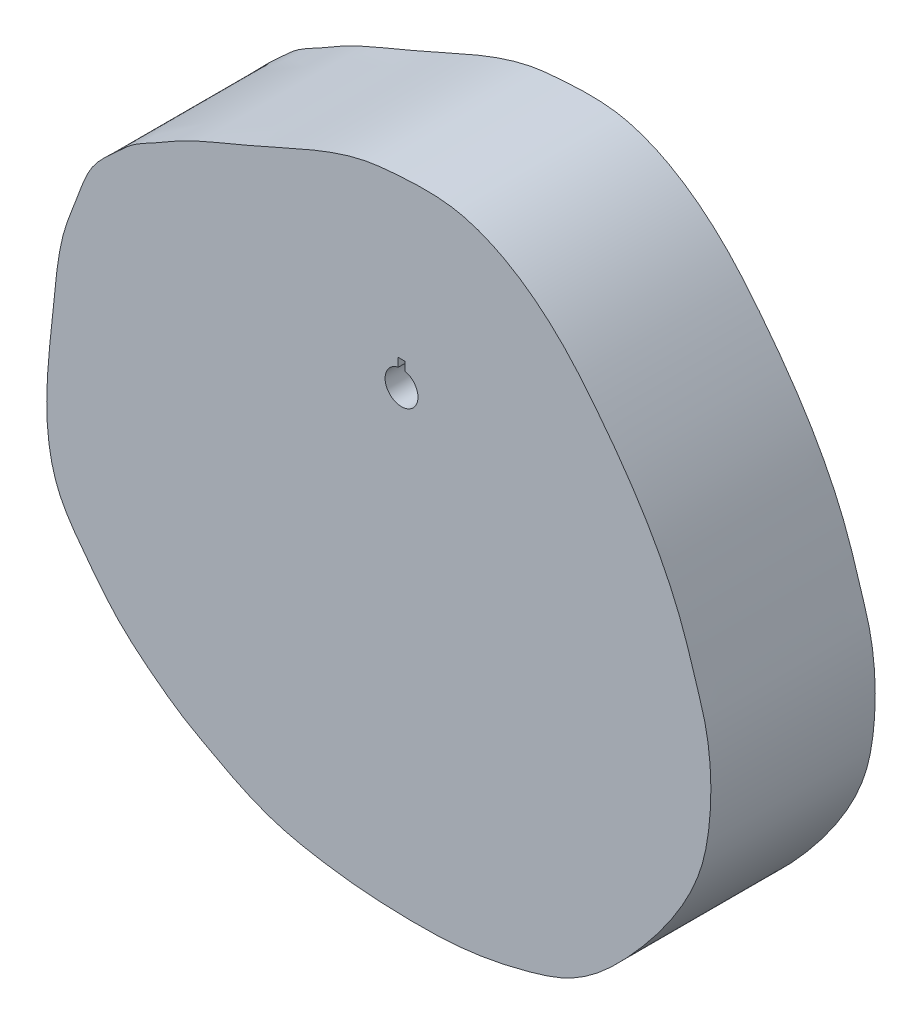
ISO-10303-21;
HEADER;
FILE_DESCRIPTION(('STEP AP214'),'2;1');
FILE_NAME('part.step','',(''),(''),'','','');
FILE_SCHEMA(('AUTOMOTIVE_DESIGN { 1 0 10303 214 1 1 1 1 }'));
ENDSEC;
DATA;
#1=APPLICATION_CONTEXT('core data for automotive mechanical design processes');
#2=APPLICATION_PROTOCOL_DEFINITION('international standard','automotive_design',2000,#1);
#3=PRODUCT_CONTEXT('',#1,'mechanical');
#4=PRODUCT('Part','Part','',(#3));
#5=PRODUCT_RELATED_PRODUCT_CATEGORY('part','',(#4));
#6=PRODUCT_DEFINITION_FORMATION('','',#4);
#7=PRODUCT_DEFINITION_CONTEXT('part definition',#1,'design');
#8=PRODUCT_DEFINITION('design','',#6,#7);
#9=PRODUCT_DEFINITION_SHAPE('','',#8);
#10=(LENGTH_UNIT() NAMED_UNIT(*) SI_UNIT(.MILLI.,.METRE.));
#11=(NAMED_UNIT(*) PLANE_ANGLE_UNIT() SI_UNIT($,.RADIAN.));
#12=(NAMED_UNIT(*) SI_UNIT($,.STERADIAN.) SOLID_ANGLE_UNIT());
#13=UNCERTAINTY_MEASURE_WITH_UNIT(LENGTH_MEASURE(1.E-05),#10,'distance_accuracy_value','');
#14=(GEOMETRIC_REPRESENTATION_CONTEXT(3) GLOBAL_UNCERTAINTY_ASSIGNED_CONTEXT((#13)) GLOBAL_UNIT_ASSIGNED_CONTEXT((#10,
#11,#12)) REPRESENTATION_CONTEXT('',''));
#15=CARTESIAN_POINT('',(0.,0.,0.));
#16=DIRECTION('',(0.,0.,1.));
#17=DIRECTION('',(1.,0.,0.));
#18=AXIS2_PLACEMENT_3D('',#15,#16,#17);
#19=CARTESIAN_POINT('',(60.2647803164845,1.48469961481105,10.));
#20=DIRECTION('',(0.999696665086117,0.0246288005330246,0.));
#21=DIRECTION('',(-0.0246288005330246,0.999696665086117,0.));
#22=AXIS2_PLACEMENT_3D('',#19,#20,#21);
#23=PLANE('',#22);
#24=DIRECTION('',(0.0246288005330246,-0.999696665086117,0.));
#25=VECTOR('',#24,1.);
#26=CARTESIAN_POINT('',(60.2647803164845,1.48469961481105,0.));
#27=LINE('',#26,#25);
#28=CARTESIAN_POINT('',(58.7,65.,0.));
#29=VERTEX_POINT('',#28);
#30=CARTESIAN_POINT('',(58.7128828561134,64.4770777295451,0.));
#31=VERTEX_POINT('',#30);
#32=EDGE_CURVE('E117',#29,#31,#27,.T.);
#33=ORIENTED_EDGE('',*,*,#32,.T.);
#34=DIRECTION('',(0.,0.,-1.));
#35=VECTOR('',#34,1.);
#36=CARTESIAN_POINT('',(58.7128828561134,64.4770777295451,10.));
#37=LINE('',#36,#35);
#38=CARTESIAN_POINT('',(58.7128828561134,64.4770777295451,10.));
#39=VERTEX_POINT('',#38);
#40=EDGE_CURVE('E11',#39,#31,#37,.T.);
#41=ORIENTED_EDGE('',*,*,#40,.F.);
#42=DIRECTION('',(0.0246288005330246,-0.999696665086117,0.));
#43=VECTOR('',#42,1.);
#44=CARTESIAN_POINT('',(60.2647803164845,1.48469961481105,10.));
#45=LINE('',#44,#43);
#46=CARTESIAN_POINT('',(58.7,65.,10.));
#47=VERTEX_POINT('',#46);
#48=EDGE_CURVE('E82',#47,#39,#45,.T.);
#49=ORIENTED_EDGE('',*,*,#48,.F.);
#50=DIRECTION('',(0.,0.,-1.));
#51=VECTOR('',#50,1.);
#52=CARTESIAN_POINT('',(58.7,65.,10.));
#53=LINE('',#52,#51);
#54=EDGE_CURVE('E58',#47,#29,#53,.T.);
#55=ORIENTED_EDGE('',*,*,#54,.T.);
#56=EDGE_LOOP('',(#33,#41,#49,#55));
#57=FACE_BOUND('',#56,.T.);
#58=ADVANCED_FACE('F41',(#57),#23,.F.);
#59=CARTESIAN_POINT('',(58.5,63.5,10.));
#60=DIRECTION('',(0.,0.,-1.));
#61=DIRECTION('',(-1.,0.,0.));
#62=AXIS2_PLACEMENT_3D('',#59,#60,#61);
#63=CYLINDRICAL_SURFACE('',#62,1.);
#64=CARTESIAN_POINT('',(58.5,63.5,0.));
#65=DIRECTION('',(0.,0.,1.));
#66=DIRECTION('',(1.,0.,0.));
#67=AXIS2_PLACEMENT_3D('',#64,#65,#66);
#68=CIRCLE('',#67,1.);
#69=CARTESIAN_POINT('',(58.3,64.4797958971133,0.));
#70=VERTEX_POINT('',#69);
#71=EDGE_CURVE('E91',#70,#31,#68,.T.);
#72=ORIENTED_EDGE('',*,*,#71,.F.);
#73=DIRECTION('',(0.,0.,-1.));
#74=VECTOR('',#73,1.);
#75=CARTESIAN_POINT('',(58.3,64.4797958971133,10.));
#76=LINE('',#75,#74);
#77=CARTESIAN_POINT('',(58.3,64.4797958971133,10.));
#78=VERTEX_POINT('',#77);
#79=EDGE_CURVE('E50',#78,#70,#76,.T.);
#80=ORIENTED_EDGE('',*,*,#79,.F.);
#81=CARTESIAN_POINT('',(58.5,63.5,10.));
#82=DIRECTION('',(0.,0.,1.));
#83=DIRECTION('',(1.,0.,0.));
#84=AXIS2_PLACEMENT_3D('',#81,#82,#83);
#85=CIRCLE('',#84,1.);
#86=EDGE_CURVE('E89',#78,#39,#85,.T.);
#87=ORIENTED_EDGE('',*,*,#86,.T.);
#88=ORIENTED_EDGE('',*,*,#40,.T.);
#89=EDGE_LOOP('',(#72,#80,#87,#88));
#90=FACE_BOUND('',#89,.T.);
#91=ADVANCED_FACE('F88',(#90),#63,.F.);
#92=CARTESIAN_POINT('',(58.3,0.,10.));
#93=DIRECTION('',(1.,0.,0.));
#94=DIRECTION('',(0.,0.,-1.));
#95=AXIS2_PLACEMENT_3D('',#92,#93,#94);
#96=PLANE('',#95);
#97=DIRECTION('',(0.,-1.,0.));
#98=VECTOR('',#97,1.);
#99=CARTESIAN_POINT('',(58.3,0.,0.));
#100=LINE('',#99,#98);
#101=CARTESIAN_POINT('',(58.3,65.,0.));
#102=VERTEX_POINT('',#101);
#103=EDGE_CURVE('E144',#102,#70,#100,.T.);
#104=ORIENTED_EDGE('',*,*,#103,.F.);
#105=DIRECTION('',(0.,0.,-1.));
#106=VECTOR('',#105,1.);
#107=CARTESIAN_POINT('',(58.3,65.,10.));
#108=LINE('',#107,#106);
#109=CARTESIAN_POINT('',(58.3,65.,10.));
#110=VERTEX_POINT('',#109);
#111=EDGE_CURVE('E71',#110,#102,#108,.T.);
#112=ORIENTED_EDGE('',*,*,#111,.F.);
#113=DIRECTION('',(0.,-1.,0.));
#114=VECTOR('',#113,1.);
#115=CARTESIAN_POINT('',(58.3,0.,10.));
#116=LINE('',#115,#114);
#117=EDGE_CURVE('E99',#110,#78,#116,.T.);
#118=ORIENTED_EDGE('',*,*,#117,.T.);
#119=ORIENTED_EDGE('',*,*,#79,.T.);
#120=EDGE_LOOP('',(#104,#112,#118,#119));
#121=FACE_BOUND('',#120,.T.);
#122=ADVANCED_FACE('F102',(#121),#96,.T.);
#123=CARTESIAN_POINT('',(0.,65.,10.));
#124=DIRECTION('',(0.,-1.,0.));
#125=DIRECTION('',(0.,0.,-1.));
#126=AXIS2_PLACEMENT_3D('',#123,#124,#125);
#127=PLANE('',#126);
#128=DIRECTION('',(-1.,0.,0.));
#129=VECTOR('',#128,1.);
#130=CARTESIAN_POINT('',(0.,65.,0.));
#131=LINE('',#130,#129);
#132=EDGE_CURVE('E147',#29,#102,#131,.T.);
#133=ORIENTED_EDGE('',*,*,#132,.F.);
#134=ORIENTED_EDGE('',*,*,#54,.F.);
#135=DIRECTION('',(-1.,0.,0.));
#136=VECTOR('',#135,1.);
#137=CARTESIAN_POINT('',(0.,65.,10.));
#138=LINE('',#137,#136);
#139=EDGE_CURVE('E104',#47,#110,#138,.T.);
#140=ORIENTED_EDGE('',*,*,#139,.T.);
#141=ORIENTED_EDGE('',*,*,#111,.T.);
#142=EDGE_LOOP('',(#133,#134,#140,#141));
#143=FACE_BOUND('',#142,.T.);
#144=ADVANCED_FACE('F127',(#143),#127,.T.);
#145=CARTESIAN_POINT('',(50.9982859504944,72.410227179123,10.));
#146=CARTESIAN_POINT('',(52.0085520398406,72.8632350951781,10.));
#147=CARTESIAN_POINT('',(53.7695737711782,73.6565490633208,10.));
#148=CARTESIAN_POINT('',(56.1979492523966,74.4105602004165,10.));
#149=CARTESIAN_POINT('',(58.2935294382534,74.6044237773413,10.));
#150=CARTESIAN_POINT('',(60.0662069810574,74.6930824065783,10.));
#151=CARTESIAN_POINT('',(62.0608422149145,74.5413517076234,10.));
#152=CARTESIAN_POINT('',(64.1262698282226,73.834318473206,10.));
#153=CARTESIAN_POINT('',(66.3492086646689,72.4904360348317,10.));
#154=CARTESIAN_POINT('',(68.4759576068629,70.6160902387612,10.));
#155=CARTESIAN_POINT('',(70.7592138576603,67.8436403335527,10.));
#156=CARTESIAN_POINT('',(73.3602957316741,64.2575230247137,10.));
#157=CARTESIAN_POINT('',(75.4594837974279,60.1789548076152,10.));
#158=CARTESIAN_POINT('',(76.357096747083,57.1264026160967,10.));
#159=CARTESIAN_POINT('',(77.0029252758511,55.061063066837,10.));
#160=CARTESIAN_POINT('',(77.35695055899,53.0176526349087,10.));
#161=CARTESIAN_POINT('',(77.3349396474433,50.2853513577748,10.));
#162=CARTESIAN_POINT('',(76.8222278468291,47.0301572790668,10.));
#163=CARTESIAN_POINT('',(75.0919714550439,43.7173208896473,10.));
#164=CARTESIAN_POINT('',(72.6547283416254,40.6943020931718,10.));
#165=CARTESIAN_POINT('',(70.4240801769504,38.5028066046952,10.));
#166=CARTESIAN_POINT('',(68.3164615286703,37.217387765986,10.));
#167=CARTESIAN_POINT('',(66.2388614862156,36.5726858861365,10.));
#168=CARTESIAN_POINT('',(63.9625768579655,36.0367681799563,10.));
#169=CARTESIAN_POINT('',(61.3674768862498,35.7018776215787,10.));
#170=CARTESIAN_POINT('',(58.7261807610321,35.6854273448347,10.));
#171=CARTESIAN_POINT('',(56.0679191285743,35.8111231598624,10.));
#172=CARTESIAN_POINT('',(53.5441679746272,36.1374827182844,10.));
#173=CARTESIAN_POINT('',(51.1189415504198,36.5945545087518,10.));
#174=CARTESIAN_POINT('',(48.8133491793314,37.5050450856228,10.));
#175=CARTESIAN_POINT('',(46.9758695760217,38.5050757308152,10.));
#176=CARTESIAN_POINT('',(45.2338461450234,39.4393400996282,10.));
#177=CARTESIAN_POINT('',(43.2773998519364,40.8418369911912,10.));
#178=CARTESIAN_POINT('',(41.1399008253625,42.5960614248552,10.));
#179=CARTESIAN_POINT('',(39.2990342505694,45.0337911249107,10.));
#180=CARTESIAN_POINT('',(37.2994587701624,47.6515807184861,10.));
#181=CARTESIAN_POINT('',(36.7666064982236,51.3900988401894,10.));
#182=CARTESIAN_POINT('',(37.0752886464358,54.9299469177596,10.));
#183=CARTESIAN_POINT('',(37.4291335747734,58.3266329294863,10.));
#184=CARTESIAN_POINT('',(37.7408596869819,61.1760889203692,10.));
#185=CARTESIAN_POINT('',(38.8007323413257,63.6679051644433,10.));
#186=CARTESIAN_POINT('',(39.4993867865125,65.7961173385119,10.));
#187=CARTESIAN_POINT('',(40.9753109636551,67.0731494206314,10.));
#188=CARTESIAN_POINT('',(42.1517449331422,68.2176150286246,10.));
#189=CARTESIAN_POINT('',(43.5098127941302,68.87913164853,10.));
#190=CARTESIAN_POINT('',(45.2241727637935,69.9431414057939,10.));
#191=CARTESIAN_POINT('',(47.3823699707558,70.8561850438718,10.));
#192=CARTESIAN_POINT('',(49.4415360563234,71.7131360685174,10.));
#193=CARTESIAN_POINT('',(50.5908921309927,72.2275499348481,10.));
#194=CARTESIAN_POINT('',(50.9982859504944,72.410227179123,10.));
#195=B_SPLINE_CURVE_WITH_KNOTS('',3,(#145,#146,#147,#148,#149,#150,#151,#152,#153,#154,#155,
#156,#157,#158,#159,#160,#161,#162,#163,#164,#165,#166,#167,#168,#169,#170,#171,#172,#173,#174,
#175,#176,#177,#178,#179,#180,#181,#182,#183,#184,#185,#186,#187,#188,#189,#190,#191,#192,#193,
#194),.UNSPECIFIED.,.T.,.F.,(4,1,1,1,1,1,1,1,1,1,1,1,1,1,1,1,1,1,1,1,1,1,1,1,1,1,1,1,1,1,1,1,1,
1,1,1,1,1,1,1,1,1,1,1,1,1,1,4),(0.,0.0265455863478481,0.0463285542264314,0.0605534748970801,
0.0768678540199245,0.0888743672957881,0.108295375419415,0.12851837030091,0.150854463167809,
0.175897919998208,0.214482615111775,0.256992751277105,0.284989029860573,0.290659406141175,
0.30887567157107,0.334400909758371,0.355920427862491,0.387259923066585,0.42247078319507,
0.449004594851348,0.461678733757254,0.481273674500077,0.500786422936165,0.517774705361233,
0.543868945946732,0.564008174833697,0.581535670918029,0.604880577497864,0.622945932639291,
0.64068846083281,0.655045157728196,0.670269378777531,0.698381103850005,0.720780203522763,
0.743530579865316,0.776229956108014,0.807771363469711,0.829063147911241,0.858259644737761,
0.875614659256024,0.894090137221274,0.910613695039342,0.921398485959152,0.933328696474983,
0.946471969326609,0.96981448338057,0.989295386703357,1.),.UNSPECIFIED.);
#196=DIRECTION('',(0.,0.,-1.));
#197=VECTOR('',#196,1.);
#198=SURFACE_OF_LINEAR_EXTRUSION('',#195,#197);
#199=CARTESIAN_POINT('',(50.9982859504944,72.410227179123,10.));
#200=VERTEX_POINT('',#199);
#201=EDGE_CURVE('E107',#200,#200,#195,.T.);
#202=ORIENTED_EDGE('',*,*,#201,.T.);
#203=EDGE_LOOP('',(#202));
#204=FACE_BOUND('',#203,.T.);
#205=CARTESIAN_POINT('',(50.9982859504944,72.410227179123,0.));
#206=CARTESIAN_POINT('',(52.0085520398406,72.8632350951781,0.));
#207=CARTESIAN_POINT('',(53.7695737711782,73.6565490633208,0.));
#208=CARTESIAN_POINT('',(56.1979492523966,74.4105602004165,0.));
#209=CARTESIAN_POINT('',(58.2935294382534,74.6044237773413,0.));
#210=CARTESIAN_POINT('',(60.0662069810574,74.6930824065783,0.));
#211=CARTESIAN_POINT('',(62.0608422149145,74.5413517076234,0.));
#212=CARTESIAN_POINT('',(64.1262698282226,73.834318473206,0.));
#213=CARTESIAN_POINT('',(66.3492086646689,72.4904360348317,0.));
#214=CARTESIAN_POINT('',(68.4759576068629,70.6160902387612,0.));
#215=CARTESIAN_POINT('',(70.7592138576603,67.8436403335527,0.));
#216=CARTESIAN_POINT('',(73.3602957316741,64.2575230247137,0.));
#217=CARTESIAN_POINT('',(75.4594837974279,60.1789548076152,0.));
#218=CARTESIAN_POINT('',(76.357096747083,57.1264026160967,0.));
#219=CARTESIAN_POINT('',(77.0029252758511,55.061063066837,0.));
#220=CARTESIAN_POINT('',(77.35695055899,53.0176526349087,0.));
#221=CARTESIAN_POINT('',(77.3349396474433,50.2853513577748,0.));
#222=CARTESIAN_POINT('',(76.8222278468291,47.0301572790668,0.));
#223=CARTESIAN_POINT('',(75.0919714550439,43.7173208896473,0.));
#224=CARTESIAN_POINT('',(72.6547283416254,40.6943020931718,0.));
#225=CARTESIAN_POINT('',(70.4240801769504,38.5028066046952,0.));
#226=CARTESIAN_POINT('',(68.3164615286703,37.217387765986,0.));
#227=CARTESIAN_POINT('',(66.2388614862156,36.5726858861365,0.));
#228=CARTESIAN_POINT('',(63.9625768579655,36.0367681799563,0.));
#229=CARTESIAN_POINT('',(61.3674768862498,35.7018776215787,0.));
#230=CARTESIAN_POINT('',(58.7261807610321,35.6854273448347,0.));
#231=CARTESIAN_POINT('',(56.0679191285743,35.8111231598624,0.));
#232=CARTESIAN_POINT('',(53.5441679746272,36.1374827182844,0.));
#233=CARTESIAN_POINT('',(51.1189415504198,36.5945545087518,0.));
#234=CARTESIAN_POINT('',(48.8133491793314,37.5050450856228,0.));
#235=CARTESIAN_POINT('',(46.9758695760217,38.5050757308152,0.));
#236=CARTESIAN_POINT('',(45.2338461450234,39.4393400996282,0.));
#237=CARTESIAN_POINT('',(43.2773998519364,40.8418369911912,0.));
#238=CARTESIAN_POINT('',(41.1399008253625,42.5960614248552,0.));
#239=CARTESIAN_POINT('',(39.2990342505694,45.0337911249107,0.));
#240=CARTESIAN_POINT('',(37.2994587701624,47.6515807184861,0.));
#241=CARTESIAN_POINT('',(36.7666064982236,51.3900988401894,0.));
#242=CARTESIAN_POINT('',(37.0752886464358,54.9299469177596,0.));
#243=CARTESIAN_POINT('',(37.4291335747734,58.3266329294863,0.));
#244=CARTESIAN_POINT('',(37.7408596869819,61.1760889203692,0.));
#245=CARTESIAN_POINT('',(38.8007323413257,63.6679051644433,0.));
#246=CARTESIAN_POINT('',(39.4993867865125,65.7961173385119,0.));
#247=CARTESIAN_POINT('',(40.9753109636551,67.0731494206314,0.));
#248=CARTESIAN_POINT('',(42.1517449331422,68.2176150286246,0.));
#249=CARTESIAN_POINT('',(43.5098127941302,68.87913164853,0.));
#250=CARTESIAN_POINT('',(45.2241727637935,69.9431414057939,0.));
#251=CARTESIAN_POINT('',(47.3823699707558,70.8561850438718,0.));
#252=CARTESIAN_POINT('',(49.4415360563234,71.7131360685174,0.));
#253=CARTESIAN_POINT('',(50.5908921309927,72.2275499348481,0.));
#254=CARTESIAN_POINT('',(50.9982859504944,72.410227179123,0.));
#255=B_SPLINE_CURVE_WITH_KNOTS('',3,(#205,#206,#207,#208,#209,#210,#211,#212,#213,#214,#215,
#216,#217,#218,#219,#220,#221,#222,#223,#224,#225,#226,#227,#228,#229,#230,#231,#232,#233,#234,
#235,#236,#237,#238,#239,#240,#241,#242,#243,#244,#245,#246,#247,#248,#249,#250,#251,#252,#253,
#254),.UNSPECIFIED.,.T.,.F.,(4,1,1,1,1,1,1,1,1,1,1,1,1,1,1,1,1,1,1,1,1,1,1,1,1,1,1,1,1,1,1,1,1,
1,1,1,1,1,1,1,1,1,1,1,1,1,1,4),(0.,0.0265455863478481,0.0463285542264314,0.0605534748970801,
0.0768678540199245,0.0888743672957881,0.108295375419415,0.12851837030091,0.150854463167809,
0.175897919998208,0.214482615111775,0.256992751277105,0.284989029860573,0.290659406141175,
0.30887567157107,0.334400909758371,0.355920427862491,0.387259923066585,0.42247078319507,
0.449004594851348,0.461678733757254,0.481273674500077,0.500786422936165,0.517774705361233,
0.543868945946732,0.564008174833697,0.581535670918029,0.604880577497864,0.622945932639291,
0.64068846083281,0.655045157728196,0.670269378777531,0.698381103850005,0.720780203522763,
0.743530579865316,0.776229956108014,0.807771363469711,0.829063147911241,0.858259644737761,
0.875614659256024,0.894090137221274,0.910613695039342,0.921398485959152,0.933328696474983,
0.946471969326609,0.96981448338057,0.989295386703357,1.),.UNSPECIFIED.);
#256=CARTESIAN_POINT('',(50.9982859504944,72.410227179123,0.));
#257=VERTEX_POINT('',#256);
#258=EDGE_CURVE('E152',#257,#257,#255,.T.);
#259=ORIENTED_EDGE('',*,*,#258,.F.);
#260=EDGE_LOOP('',(#259));
#261=FACE_BOUND('',#260,.T.);
#262=ADVANCED_FACE('F123',(#204,#261),#198,.T.);
#263=CARTESIAN_POINT('',(0.,0.,10.));
#264=DIRECTION('',(0.,0.,1.));
#265=DIRECTION('',(1.,0.,0.));
#266=AXIS2_PLACEMENT_3D('',#263,#264,#265);
#267=PLANE('',#266);
#268=ORIENTED_EDGE('',*,*,#48,.T.);
#269=ORIENTED_EDGE('',*,*,#86,.F.);
#270=ORIENTED_EDGE('',*,*,#117,.F.);
#271=ORIENTED_EDGE('',*,*,#139,.F.);
#272=EDGE_LOOP('',(#268,#269,#270,#271));
#273=FACE_BOUND('',#272,.T.);
#274=ORIENTED_EDGE('',*,*,#201,.F.);
#275=EDGE_LOOP('',(#274));
#276=FACE_BOUND('',#275,.T.);
#277=ADVANCED_FACE('F97',(#273,#276),#267,.T.);
#278=CARTESIAN_POINT('',(0.,0.,0.));
#279=DIRECTION('',(0.,0.,1.));
#280=DIRECTION('',(1.,0.,0.));
#281=AXIS2_PLACEMENT_3D('',#278,#279,#280);
#282=PLANE('',#281);
#283=ORIENTED_EDGE('',*,*,#32,.F.);
#284=ORIENTED_EDGE('',*,*,#132,.T.);
#285=ORIENTED_EDGE('',*,*,#103,.T.);
#286=ORIENTED_EDGE('',*,*,#71,.T.);
#287=EDGE_LOOP('',(#283,#284,#285,#286));
#288=FACE_BOUND('',#287,.T.);
#289=ORIENTED_EDGE('',*,*,#258,.T.);
#290=EDGE_LOOP('',(#289));
#291=FACE_BOUND('',#290,.T.);
#292=ADVANCED_FACE('F129',(#288,#291),#282,.F.);
#293=CLOSED_SHELL('',(#58,#91,#122,#144,#262,#277,#292));
#294=MANIFOLD_SOLID_BREP('B2',#293);
#295=ADVANCED_BREP_SHAPE_REPRESENTATION('',(#18,#294),#14);
#296=SHAPE_DEFINITION_REPRESENTATION(#9,#295);
ENDSEC;
END-ISO-10303-21;
